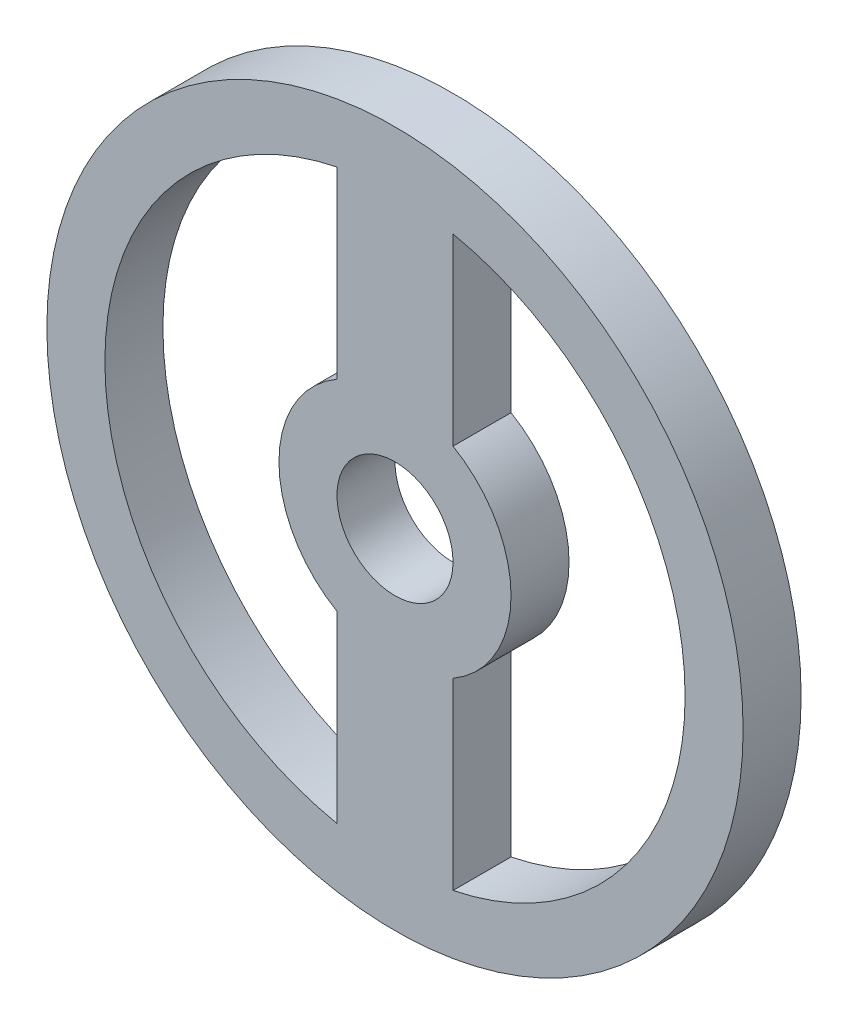
ISO-10303-21;
HEADER;
FILE_DESCRIPTION(('STEP AP214'),'2;1');
FILE_NAME('part.step','',(''),(''),'','','');
FILE_SCHEMA(('AUTOMOTIVE_DESIGN { 1 0 10303 214 1 1 1 1 }'));
ENDSEC;
DATA;
#1=APPLICATION_CONTEXT('core data for automotive mechanical design processes');
#2=APPLICATION_PROTOCOL_DEFINITION('international standard','automotive_design',2000,#1);
#3=PRODUCT_CONTEXT('',#1,'mechanical');
#4=PRODUCT('Part','Part','',(#3));
#5=PRODUCT_RELATED_PRODUCT_CATEGORY('part','',(#4));
#6=PRODUCT_DEFINITION_FORMATION('','',#4);
#7=PRODUCT_DEFINITION_CONTEXT('part definition',#1,'design');
#8=PRODUCT_DEFINITION('design','',#6,#7);
#9=PRODUCT_DEFINITION_SHAPE('','',#8);
#10=(LENGTH_UNIT() NAMED_UNIT(*) SI_UNIT(.MILLI.,.METRE.));
#11=(NAMED_UNIT(*) PLANE_ANGLE_UNIT() SI_UNIT($,.RADIAN.));
#12=(NAMED_UNIT(*) SI_UNIT($,.STERADIAN.) SOLID_ANGLE_UNIT());
#13=UNCERTAINTY_MEASURE_WITH_UNIT(LENGTH_MEASURE(1.E-05),#10,'distance_accuracy_value','');
#14=(GEOMETRIC_REPRESENTATION_CONTEXT(3) GLOBAL_UNCERTAINTY_ASSIGNED_CONTEXT((#13)) GLOBAL_UNIT_ASSIGNED_CONTEXT((#10,
#11,#12)) REPRESENTATION_CONTEXT('',''));
#15=CARTESIAN_POINT('',(0.,0.,0.));
#16=DIRECTION('',(0.,0.,1.));
#17=DIRECTION('',(1.,0.,0.));
#18=AXIS2_PLACEMENT_3D('',#15,#16,#17);
#19=CARTESIAN_POINT('',(0.,0.,5.));
#20=DIRECTION('',(0.,0.,1.));
#21=DIRECTION('',(1.,0.,0.));
#22=AXIS2_PLACEMENT_3D('',#19,#20,#21);
#23=PLANE('',#22);
#24=DIRECTION('',(0.,1.,0.));
#25=VECTOR('',#24,1.);
#26=CARTESIAN_POINT('',(-5.,24.4948974278318,5.));
#27=LINE('',#26,#25);
#28=CARTESIAN_POINT('',(-5.,8.66025403784439,5.));
#29=VERTEX_POINT('',#28);
#30=CARTESIAN_POINT('',(-5.,24.4948974278318,5.));
#31=VERTEX_POINT('',#30);
#32=EDGE_CURVE('E145',#29,#31,#27,.T.);
#33=ORIENTED_EDGE('',*,*,#32,.F.);
#34=CARTESIAN_POINT('',(0.,0.,5.));
#35=DIRECTION('',(0.,0.,-1.));
#36=DIRECTION('',(1.,0.,0.));
#37=AXIS2_PLACEMENT_3D('',#34,#35,#36);
#38=CIRCLE('',#37,10.);
#39=CARTESIAN_POINT('',(-5.,-8.66025403784439,5.));
#40=VERTEX_POINT('',#39);
#41=EDGE_CURVE('E143',#40,#29,#38,.T.);
#42=ORIENTED_EDGE('',*,*,#41,.F.);
#43=DIRECTION('',(0.,1.,0.));
#44=VECTOR('',#43,1.);
#45=CARTESIAN_POINT('',(-5.,-8.66025403784439,5.));
#46=LINE('',#45,#44);
#47=CARTESIAN_POINT('',(-5.,-24.4948974278318,5.));
#48=VERTEX_POINT('',#47);
#49=EDGE_CURVE('E151',#48,#40,#46,.T.);
#50=ORIENTED_EDGE('',*,*,#49,.F.);
#51=CARTESIAN_POINT('',(0.,0.,5.));
#52=DIRECTION('',(0.,0.,1.));
#53=DIRECTION('',(1.,0.,0.));
#54=AXIS2_PLACEMENT_3D('',#51,#52,#53);
#55=CIRCLE('',#54,25.);
#56=EDGE_CURVE('E148',#31,#48,#55,.T.);
#57=ORIENTED_EDGE('',*,*,#56,.F.);
#58=EDGE_LOOP('',(#33,#42,#50,#57));
#59=FACE_BOUND('',#58,.T.);
#60=CARTESIAN_POINT('',(0.,0.,5.));
#61=DIRECTION('',(0.,0.,1.));
#62=DIRECTION('',(1.,0.,0.));
#63=AXIS2_PLACEMENT_3D('',#60,#61,#62);
#64=CIRCLE('',#63,30.);
#65=CARTESIAN_POINT('',(30.,0.,5.));
#66=VERTEX_POINT('',#65);
#67=EDGE_CURVE('E11',#66,#66,#64,.T.);
#68=ORIENTED_EDGE('',*,*,#67,.T.);
#69=EDGE_LOOP('',(#68));
#70=FACE_BOUND('',#69,.T.);
#71=CARTESIAN_POINT('',(0.,0.,5.));
#72=DIRECTION('',(0.,0.,1.));
#73=DIRECTION('',(1.,0.,0.));
#74=AXIS2_PLACEMENT_3D('',#71,#72,#73);
#75=CIRCLE('',#74,5.);
#76=CARTESIAN_POINT('',(5.,0.,5.));
#77=VERTEX_POINT('',#76);
#78=EDGE_CURVE('E137',#77,#77,#75,.T.);
#79=ORIENTED_EDGE('',*,*,#78,.F.);
#80=EDGE_LOOP('',(#79));
#81=FACE_BOUND('',#80,.T.);
#82=DIRECTION('',(0.,-1.,0.));
#83=VECTOR('',#82,1.);
#84=CARTESIAN_POINT('',(5.,24.4948974278318,5.));
#85=LINE('',#84,#83);
#86=CARTESIAN_POINT('',(5.,24.4948974278318,5.));
#87=VERTEX_POINT('',#86);
#88=CARTESIAN_POINT('',(5.,8.66025403784439,5.));
#89=VERTEX_POINT('',#88);
#90=EDGE_CURVE('E109',#87,#89,#85,.T.);
#91=ORIENTED_EDGE('',*,*,#90,.F.);
#92=CARTESIAN_POINT('',(0.,0.,5.));
#93=DIRECTION('',(0.,0.,1.));
#94=DIRECTION('',(1.,0.,0.));
#95=AXIS2_PLACEMENT_3D('',#92,#93,#94);
#96=CIRCLE('',#95,25.);
#97=CARTESIAN_POINT('',(5.,-24.4948974278318,5.));
#98=VERTEX_POINT('',#97);
#99=EDGE_CURVE('E101',#98,#87,#96,.T.);
#100=ORIENTED_EDGE('',*,*,#99,.F.);
#101=DIRECTION('',(0.,-1.,0.));
#102=VECTOR('',#101,1.);
#103=CARTESIAN_POINT('',(5.,-8.66025403784439,5.));
#104=LINE('',#103,#102);
#105=CARTESIAN_POINT('',(5.,-8.66025403784439,5.));
#106=VERTEX_POINT('',#105);
#107=EDGE_CURVE('E123',#106,#98,#104,.T.);
#108=ORIENTED_EDGE('',*,*,#107,.F.);
#109=CARTESIAN_POINT('',(0.,0.,5.));
#110=DIRECTION('',(0.,0.,-1.));
#111=DIRECTION('',(1.,0.,0.));
#112=AXIS2_PLACEMENT_3D('',#109,#110,#111);
#113=CIRCLE('',#112,10.);
#114=EDGE_CURVE('E121',#89,#106,#113,.T.);
#115=ORIENTED_EDGE('',*,*,#114,.F.);
#116=EDGE_LOOP('',(#91,#100,#108,#115));
#117=FACE_BOUND('',#116,.T.);
#118=ADVANCED_FACE('F36',(#59,#70,#81,#117),#23,.T.);
#119=CARTESIAN_POINT('',(0.,0.,0.));
#120=DIRECTION('',(0.,0.,1.));
#121=DIRECTION('',(1.,0.,0.));
#122=AXIS2_PLACEMENT_3D('',#119,#120,#121);
#123=PLANE('',#122);
#124=CARTESIAN_POINT('',(0.,0.,0.));
#125=DIRECTION('',(0.,0.,1.));
#126=DIRECTION('',(1.,0.,0.));
#127=AXIS2_PLACEMENT_3D('',#124,#125,#126);
#128=CIRCLE('',#127,5.);
#129=CARTESIAN_POINT('',(5.,0.,0.));
#130=VERTEX_POINT('',#129);
#131=EDGE_CURVE('E117',#130,#130,#128,.T.);
#132=ORIENTED_EDGE('',*,*,#131,.T.);
#133=EDGE_LOOP('',(#132));
#134=FACE_BOUND('',#133,.T.);
#135=CARTESIAN_POINT('',(0.,0.,0.));
#136=DIRECTION('',(0.,0.,-1.));
#137=DIRECTION('',(1.,0.,0.));
#138=AXIS2_PLACEMENT_3D('',#135,#136,#137);
#139=CIRCLE('',#138,10.);
#140=CARTESIAN_POINT('',(-5.,-8.66025403784439,0.));
#141=VERTEX_POINT('',#140);
#142=CARTESIAN_POINT('',(-5.,8.66025403784439,0.));
#143=VERTEX_POINT('',#142);
#144=EDGE_CURVE('E140',#141,#143,#139,.T.);
#145=ORIENTED_EDGE('',*,*,#144,.T.);
#146=DIRECTION('',(0.,1.,0.));
#147=VECTOR('',#146,1.);
#148=CARTESIAN_POINT('',(-5.,24.4948974278318,0.));
#149=LINE('',#148,#147);
#150=CARTESIAN_POINT('',(-5.,24.4948974278318,0.));
#151=VERTEX_POINT('',#150);
#152=EDGE_CURVE('E156',#143,#151,#149,.T.);
#153=ORIENTED_EDGE('',*,*,#152,.T.);
#154=CARTESIAN_POINT('',(0.,0.,0.));
#155=DIRECTION('',(0.,0.,1.));
#156=DIRECTION('',(1.,0.,0.));
#157=AXIS2_PLACEMENT_3D('',#154,#155,#156);
#158=CIRCLE('',#157,25.);
#159=CARTESIAN_POINT('',(-5.00000000000001,-24.4948974278318,0.));
#160=VERTEX_POINT('',#159);
#161=EDGE_CURVE('E159',#151,#160,#158,.T.);
#162=ORIENTED_EDGE('',*,*,#161,.T.);
#163=DIRECTION('',(0.,1.,0.));
#164=VECTOR('',#163,1.);
#165=CARTESIAN_POINT('',(-5.,-8.66025403784439,0.));
#166=LINE('',#165,#164);
#167=EDGE_CURVE('E146',#160,#141,#166,.T.);
#168=ORIENTED_EDGE('',*,*,#167,.T.);
#169=EDGE_LOOP('',(#145,#153,#162,#168));
#170=FACE_BOUND('',#169,.T.);
#171=CARTESIAN_POINT('',(0.,0.,0.));
#172=DIRECTION('',(0.,0.,1.));
#173=DIRECTION('',(1.,0.,0.));
#174=AXIS2_PLACEMENT_3D('',#171,#172,#173);
#175=CIRCLE('',#174,30.);
#176=CARTESIAN_POINT('',(30.,0.,0.));
#177=VERTEX_POINT('',#176);
#178=EDGE_CURVE('E40',#177,#177,#175,.T.);
#179=ORIENTED_EDGE('',*,*,#178,.F.);
#180=EDGE_LOOP('',(#179));
#181=FACE_BOUND('',#180,.T.);
#182=CARTESIAN_POINT('',(0.,0.,0.));
#183=DIRECTION('',(0.,0.,1.));
#184=DIRECTION('',(1.,0.,0.));
#185=AXIS2_PLACEMENT_3D('',#182,#183,#184);
#186=CIRCLE('',#185,25.);
#187=CARTESIAN_POINT('',(5.,-24.4948974278318,0.));
#188=VERTEX_POINT('',#187);
#189=CARTESIAN_POINT('',(5.,24.4948974278318,0.));
#190=VERTEX_POINT('',#189);
#191=EDGE_CURVE('E59',#188,#190,#186,.T.);
#192=ORIENTED_EDGE('',*,*,#191,.T.);
#193=DIRECTION('',(0.,-1.,0.));
#194=VECTOR('',#193,1.);
#195=CARTESIAN_POINT('',(5.,24.4948974278318,0.));
#196=LINE('',#195,#194);
#197=CARTESIAN_POINT('',(5.,8.66025403784439,0.));
#198=VERTEX_POINT('',#197);
#199=EDGE_CURVE('E116',#190,#198,#196,.T.);
#200=ORIENTED_EDGE('',*,*,#199,.T.);
#201=CARTESIAN_POINT('',(0.,0.,0.));
#202=DIRECTION('',(0.,0.,-1.));
#203=DIRECTION('',(1.,0.,0.));
#204=AXIS2_PLACEMENT_3D('',#201,#202,#203);
#205=CIRCLE('',#204,10.);
#206=CARTESIAN_POINT('',(5.,-8.66025403784439,0.));
#207=VERTEX_POINT('',#206);
#208=EDGE_CURVE('E129',#198,#207,#205,.T.);
#209=ORIENTED_EDGE('',*,*,#208,.T.);
#210=DIRECTION('',(0.,-1.,0.));
#211=VECTOR('',#210,1.);
#212=CARTESIAN_POINT('',(5.,-8.66025403784439,0.));
#213=LINE('',#212,#211);
#214=EDGE_CURVE('E110',#207,#188,#213,.T.);
#215=ORIENTED_EDGE('',*,*,#214,.T.);
#216=EDGE_LOOP('',(#192,#200,#209,#215));
#217=FACE_BOUND('',#216,.T.);
#218=ADVANCED_FACE('F178',(#134,#170,#181,#217),#123,.F.);
#219=CARTESIAN_POINT('',(0.,0.,5.));
#220=DIRECTION('',(0.,0.,-1.));
#221=DIRECTION('',(-1.,0.,0.));
#222=AXIS2_PLACEMENT_3D('',#219,#220,#221);
#223=CYLINDRICAL_SURFACE('',#222,30.);
#224=ORIENTED_EDGE('',*,*,#67,.F.);
#225=EDGE_LOOP('',(#224));
#226=FACE_BOUND('',#225,.T.);
#227=ORIENTED_EDGE('',*,*,#178,.T.);
#228=EDGE_LOOP('',(#227));
#229=FACE_BOUND('',#228,.T.);
#230=ADVANCED_FACE('F38',(#226,#229),#223,.T.);
#231=CARTESIAN_POINT('',(0.,0.,5.));
#232=DIRECTION('',(0.,0.,-1.));
#233=DIRECTION('',(-1.,0.,0.));
#234=AXIS2_PLACEMENT_3D('',#231,#232,#233);
#235=CYLINDRICAL_SURFACE('',#234,10.);
#236=ORIENTED_EDGE('',*,*,#144,.F.);
#237=DIRECTION('',(0.,0.,-1.));
#238=VECTOR('',#237,1.);
#239=CARTESIAN_POINT('',(-5.,-8.66025403784439,5.));
#240=LINE('',#239,#238);
#241=EDGE_CURVE('E153',#40,#141,#240,.T.);
#242=ORIENTED_EDGE('',*,*,#241,.F.);
#243=ORIENTED_EDGE('',*,*,#41,.T.);
#244=DIRECTION('',(0.,0.,-1.));
#245=VECTOR('',#244,1.);
#246=CARTESIAN_POINT('',(-5.,8.66025403784439,5.));
#247=LINE('',#246,#245);
#248=EDGE_CURVE('E170',#29,#143,#247,.T.);
#249=ORIENTED_EDGE('',*,*,#248,.T.);
#250=EDGE_LOOP('',(#236,#242,#243,#249));
#251=FACE_BOUND('',#250,.T.);
#252=ADVANCED_FACE('F199',(#251),#235,.T.);
#253=CARTESIAN_POINT('',(-5.,24.4948974278318,5.));
#254=DIRECTION('',(-1.,0.,0.));
#255=DIRECTION('',(0.,0.,1.));
#256=AXIS2_PLACEMENT_3D('',#253,#254,#255);
#257=PLANE('',#256);
#258=ORIENTED_EDGE('',*,*,#152,.F.);
#259=ORIENTED_EDGE('',*,*,#248,.F.);
#260=ORIENTED_EDGE('',*,*,#32,.T.);
#261=DIRECTION('',(0.,0.,-1.));
#262=VECTOR('',#261,1.);
#263=CARTESIAN_POINT('',(-5.,24.4948974278318,5.));
#264=LINE('',#263,#262);
#265=EDGE_CURVE('E168',#31,#151,#264,.T.);
#266=ORIENTED_EDGE('',*,*,#265,.T.);
#267=EDGE_LOOP('',(#258,#259,#260,#266));
#268=FACE_BOUND('',#267,.T.);
#269=ADVANCED_FACE('F202',(#268),#257,.T.);
#270=CARTESIAN_POINT('',(0.,0.,5.));
#271=DIRECTION('',(0.,0.,-1.));
#272=DIRECTION('',(-1.,0.,0.));
#273=AXIS2_PLACEMENT_3D('',#270,#271,#272);
#274=CYLINDRICAL_SURFACE('',#273,25.);
#275=ORIENTED_EDGE('',*,*,#161,.F.);
#276=ORIENTED_EDGE('',*,*,#265,.F.);
#277=ORIENTED_EDGE('',*,*,#56,.T.);
#278=DIRECTION('',(0.,0.,-1.));
#279=VECTOR('',#278,1.);
#280=CARTESIAN_POINT('',(-5.00000000000001,-24.4948974278318,5.));
#281=LINE('',#280,#279);
#282=EDGE_CURVE('E166',#48,#160,#281,.T.);
#283=ORIENTED_EDGE('',*,*,#282,.T.);
#284=EDGE_LOOP('',(#275,#276,#277,#283));
#285=FACE_BOUND('',#284,.T.);
#286=ADVANCED_FACE('F205',(#285),#274,.F.);
#287=CARTESIAN_POINT('',(-5.,-8.66025403784439,5.));
#288=DIRECTION('',(-1.,0.,0.));
#289=DIRECTION('',(0.,0.,1.));
#290=AXIS2_PLACEMENT_3D('',#287,#288,#289);
#291=PLANE('',#290);
#292=ORIENTED_EDGE('',*,*,#167,.F.);
#293=ORIENTED_EDGE('',*,*,#282,.F.);
#294=ORIENTED_EDGE('',*,*,#49,.T.);
#295=ORIENTED_EDGE('',*,*,#241,.T.);
#296=EDGE_LOOP('',(#292,#293,#294,#295));
#297=FACE_BOUND('',#296,.T.);
#298=ADVANCED_FACE('F209',(#297),#291,.T.);
#299=CARTESIAN_POINT('',(0.,0.,5.));
#300=DIRECTION('',(0.,0.,-1.));
#301=DIRECTION('',(-1.,0.,0.));
#302=AXIS2_PLACEMENT_3D('',#299,#300,#301);
#303=CYLINDRICAL_SURFACE('',#302,5.);
#304=ORIENTED_EDGE('',*,*,#78,.T.);
#305=EDGE_LOOP('',(#304));
#306=FACE_BOUND('',#305,.T.);
#307=ORIENTED_EDGE('',*,*,#131,.F.);
#308=EDGE_LOOP('',(#307));
#309=FACE_BOUND('',#308,.T.);
#310=ADVANCED_FACE('F213',(#306,#309),#303,.F.);
#311=CARTESIAN_POINT('',(0.,0.,5.));
#312=DIRECTION('',(0.,0.,-1.));
#313=DIRECTION('',(-1.,0.,0.));
#314=AXIS2_PLACEMENT_3D('',#311,#312,#313);
#315=CYLINDRICAL_SURFACE('',#314,25.);
#316=ORIENTED_EDGE('',*,*,#191,.F.);
#317=DIRECTION('',(0.,0.,-1.));
#318=VECTOR('',#317,1.);
#319=CARTESIAN_POINT('',(5.,-24.4948974278318,5.));
#320=LINE('',#319,#318);
#321=EDGE_CURVE('E105',#98,#188,#320,.T.);
#322=ORIENTED_EDGE('',*,*,#321,.F.);
#323=ORIENTED_EDGE('',*,*,#99,.T.);
#324=DIRECTION('',(0.,0.,-1.));
#325=VECTOR('',#324,1.);
#326=CARTESIAN_POINT('',(5.,24.4948974278318,5.));
#327=LINE('',#326,#325);
#328=EDGE_CURVE('E104',#87,#190,#327,.T.);
#329=ORIENTED_EDGE('',*,*,#328,.T.);
#330=EDGE_LOOP('',(#316,#322,#323,#329));
#331=FACE_BOUND('',#330,.T.);
#332=ADVANCED_FACE('F103',(#331),#315,.F.);
#333=CARTESIAN_POINT('',(5.,24.4948974278318,5.));
#334=DIRECTION('',(1.,0.,0.));
#335=DIRECTION('',(0.,0.,-1.));
#336=AXIS2_PLACEMENT_3D('',#333,#334,#335);
#337=PLANE('',#336);
#338=ORIENTED_EDGE('',*,*,#199,.F.);
#339=ORIENTED_EDGE('',*,*,#328,.F.);
#340=ORIENTED_EDGE('',*,*,#90,.T.);
#341=DIRECTION('',(0.,0.,-1.));
#342=VECTOR('',#341,1.);
#343=CARTESIAN_POINT('',(5.,8.66025403784439,5.));
#344=LINE('',#343,#342);
#345=EDGE_CURVE('E118',#89,#198,#344,.T.);
#346=ORIENTED_EDGE('',*,*,#345,.T.);
#347=EDGE_LOOP('',(#338,#339,#340,#346));
#348=FACE_BOUND('',#347,.T.);
#349=ADVANCED_FACE('F113',(#348),#337,.T.);
#350=CARTESIAN_POINT('',(0.,0.,5.));
#351=DIRECTION('',(0.,0.,-1.));
#352=DIRECTION('',(-1.,0.,0.));
#353=AXIS2_PLACEMENT_3D('',#350,#351,#352);
#354=CYLINDRICAL_SURFACE('',#353,10.);
#355=ORIENTED_EDGE('',*,*,#208,.F.);
#356=ORIENTED_EDGE('',*,*,#345,.F.);
#357=ORIENTED_EDGE('',*,*,#114,.T.);
#358=DIRECTION('',(0.,0.,-1.));
#359=VECTOR('',#358,1.);
#360=CARTESIAN_POINT('',(5.,-8.66025403784439,5.));
#361=LINE('',#360,#359);
#362=EDGE_CURVE('E51',#106,#207,#361,.T.);
#363=ORIENTED_EDGE('',*,*,#362,.T.);
#364=EDGE_LOOP('',(#355,#356,#357,#363));
#365=FACE_BOUND('',#364,.T.);
#366=ADVANCED_FACE('F185',(#365),#354,.T.);
#367=CARTESIAN_POINT('',(5.,-8.66025403784439,5.));
#368=DIRECTION('',(1.,0.,0.));
#369=DIRECTION('',(0.,0.,-1.));
#370=AXIS2_PLACEMENT_3D('',#367,#368,#369);
#371=PLANE('',#370);
#372=ORIENTED_EDGE('',*,*,#214,.F.);
#373=ORIENTED_EDGE('',*,*,#362,.F.);
#374=ORIENTED_EDGE('',*,*,#107,.T.);
#375=ORIENTED_EDGE('',*,*,#321,.T.);
#376=EDGE_LOOP('',(#372,#373,#374,#375));
#377=FACE_BOUND('',#376,.T.);
#378=ADVANCED_FACE('F183',(#377),#371,.T.);
#379=CLOSED_SHELL('',(#118,#218,#230,#252,#269,#286,#298,#310,#332,#349,#366,#378));
#380=MANIFOLD_SOLID_BREP('B2',#379);
#381=ADVANCED_BREP_SHAPE_REPRESENTATION('',(#18,#380),#14);
#382=SHAPE_DEFINITION_REPRESENTATION(#9,#381);
ENDSEC;
END-ISO-10303-21;
